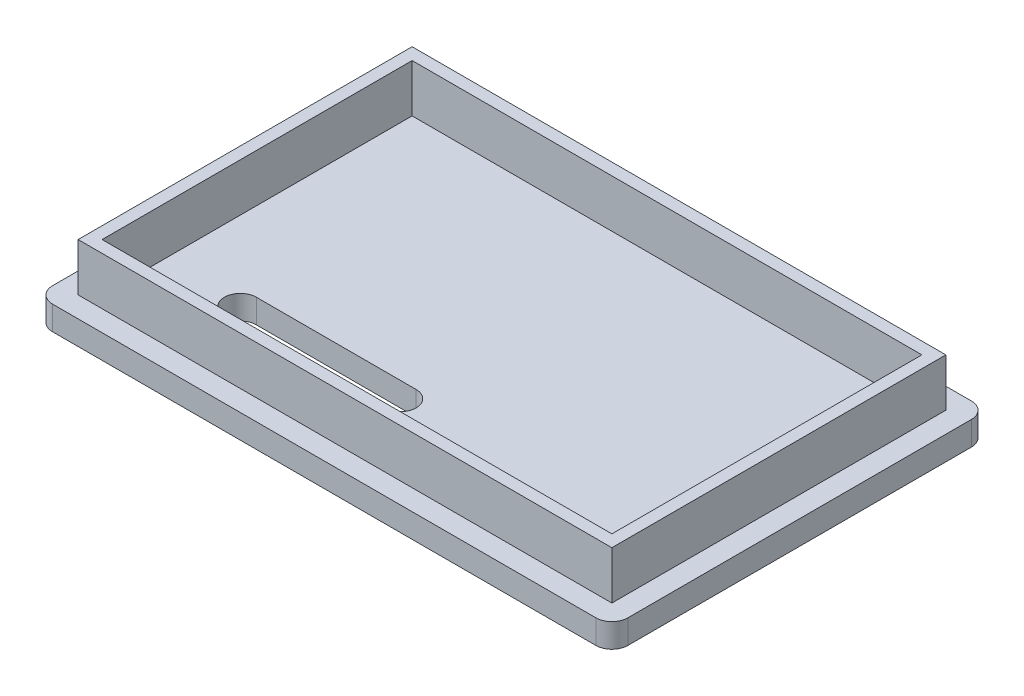
ISO-10303-21;
HEADER;
FILE_DESCRIPTION(('STEP AP214'),'2;1');
FILE_NAME('part.step','',(''),(''),'','','');
FILE_SCHEMA(('AUTOMOTIVE_DESIGN { 1 0 10303 214 1 1 1 1 }'));
ENDSEC;
DATA;
#1=APPLICATION_CONTEXT('core data for automotive mechanical design processes');
#2=APPLICATION_PROTOCOL_DEFINITION('international standard','automotive_design',2000,#1);
#3=PRODUCT_CONTEXT('',#1,'mechanical');
#4=PRODUCT('Part','Part','',(#3));
#5=PRODUCT_RELATED_PRODUCT_CATEGORY('part','',(#4));
#6=PRODUCT_DEFINITION_FORMATION('','',#4);
#7=PRODUCT_DEFINITION_CONTEXT('part definition',#1,'design');
#8=PRODUCT_DEFINITION('design','',#6,#7);
#9=PRODUCT_DEFINITION_SHAPE('','',#8);
#10=(LENGTH_UNIT() NAMED_UNIT(*) SI_UNIT(.MILLI.,.METRE.));
#11=(NAMED_UNIT(*) PLANE_ANGLE_UNIT() SI_UNIT($,.RADIAN.));
#12=(NAMED_UNIT(*) SI_UNIT($,.STERADIAN.) SOLID_ANGLE_UNIT());
#13=UNCERTAINTY_MEASURE_WITH_UNIT(LENGTH_MEASURE(1.E-05),#10,'distance_accuracy_value','');
#14=(GEOMETRIC_REPRESENTATION_CONTEXT(3) GLOBAL_UNCERTAINTY_ASSIGNED_CONTEXT((#13)) GLOBAL_UNIT_ASSIGNED_CONTEXT((#10,
#11,#12)) REPRESENTATION_CONTEXT('',''));
#15=CARTESIAN_POINT('',(0.,0.,0.));
#16=DIRECTION('',(0.,0.,1.));
#17=DIRECTION('',(1.,0.,0.));
#18=AXIS2_PLACEMENT_3D('',#15,#16,#17);
#19=CARTESIAN_POINT('',(0.,3.,0.));
#20=DIRECTION('',(0.,-1.,0.));
#21=DIRECTION('',(0.,0.,-1.));
#22=AXIS2_PLACEMENT_3D('',#19,#20,#21);
#23=PLANE('',#22);
#24=DIRECTION('',(0.,0.,-1.));
#25=VECTOR('',#24,1.);
#26=CARTESIAN_POINT('',(0.,3.,0.));
#27=LINE('',#26,#25);
#28=CARTESIAN_POINT('',(0.,3.,-2.));
#29=VERTEX_POINT('',#28);
#30=CARTESIAN_POINT('',(0.,3.,-45.));
#31=VERTEX_POINT('',#30);
#32=EDGE_CURVE('E306',#29,#31,#27,.T.);
#33=ORIENTED_EDGE('',*,*,#32,.F.);
#34=CARTESIAN_POINT('',(2.,3.,-2.));
#35=DIRECTION('',(0.,-1.,0.));
#36=DIRECTION('',(0.,0.,-1.));
#37=AXIS2_PLACEMENT_3D('',#34,#35,#36);
#38=CIRCLE('',#37,2.);
#39=CARTESIAN_POINT('',(2.,3.,0.));
#40=VERTEX_POINT('',#39);
#41=EDGE_CURVE('E372',#29,#40,#38,.F.);
#42=ORIENTED_EDGE('',*,*,#41,.T.);
#43=DIRECTION('',(1.,0.,0.));
#44=VECTOR('',#43,1.);
#45=CARTESIAN_POINT('',(0.,3.,0.));
#46=LINE('',#45,#44);
#47=CARTESIAN_POINT('',(70.,3.,0.));
#48=VERTEX_POINT('',#47);
#49=EDGE_CURVE('E319',#40,#48,#46,.T.);
#50=ORIENTED_EDGE('',*,*,#49,.T.);
#51=CARTESIAN_POINT('',(70.,3.,-2.));
#52=DIRECTION('',(0.,-1.,0.));
#53=DIRECTION('',(0.,0.,-1.));
#54=AXIS2_PLACEMENT_3D('',#51,#52,#53);
#55=CIRCLE('',#54,2.);
#56=CARTESIAN_POINT('',(72.,3.,-2.));
#57=VERTEX_POINT('',#56);
#58=EDGE_CURVE('E363',#48,#57,#55,.F.);
#59=ORIENTED_EDGE('',*,*,#58,.T.);
#60=DIRECTION('',(0.,0.,-1.));
#61=VECTOR('',#60,1.);
#62=CARTESIAN_POINT('',(72.,3.,0.));
#63=LINE('',#62,#61);
#64=CARTESIAN_POINT('',(72.,3.,-45.));
#65=VERTEX_POINT('',#64);
#66=EDGE_CURVE('E315',#57,#65,#63,.T.);
#67=ORIENTED_EDGE('',*,*,#66,.T.);
#68=CARTESIAN_POINT('',(70.,3.,-45.));
#69=DIRECTION('',(0.,-1.,0.));
#70=DIRECTION('',(0.,0.,-1.));
#71=AXIS2_PLACEMENT_3D('',#68,#69,#70);
#72=CIRCLE('',#71,2.);
#73=CARTESIAN_POINT('',(70.,3.,-47.));
#74=VERTEX_POINT('',#73);
#75=EDGE_CURVE('E366',#65,#74,#72,.F.);
#76=ORIENTED_EDGE('',*,*,#75,.T.);
#77=DIRECTION('',(1.,0.,0.));
#78=VECTOR('',#77,1.);
#79=CARTESIAN_POINT('',(0.,3.,-47.));
#80=LINE('',#79,#78);
#81=CARTESIAN_POINT('',(2.,3.,-47.));
#82=VERTEX_POINT('',#81);
#83=EDGE_CURVE('E310',#82,#74,#80,.T.);
#84=ORIENTED_EDGE('',*,*,#83,.F.);
#85=CARTESIAN_POINT('',(2.,3.,-45.));
#86=DIRECTION('',(0.,-1.,0.));
#87=DIRECTION('',(0.,0.,-1.));
#88=AXIS2_PLACEMENT_3D('',#85,#86,#87);
#89=CIRCLE('',#88,2.);
#90=EDGE_CURVE('E369',#82,#31,#89,.F.);
#91=ORIENTED_EDGE('',*,*,#90,.T.);
#92=EDGE_LOOP('',(#33,#42,#50,#59,#67,#76,#84,#91));
#93=FACE_BOUND('',#92,.T.);
#94=DIRECTION('',(0.,0.,1.));
#95=VECTOR('',#94,1.);
#96=CARTESIAN_POINT('',(2.6,3.,-44.4));
#97=LINE('',#96,#95);
#98=CARTESIAN_POINT('',(2.6,3.,-44.4));
#99=VERTEX_POINT('',#98);
#100=CARTESIAN_POINT('',(2.6,3.,-2.6));
#101=VERTEX_POINT('',#100);
#102=EDGE_CURVE('E260',#99,#101,#97,.T.);
#103=ORIENTED_EDGE('',*,*,#102,.F.);
#104=DIRECTION('',(-1.,0.,0.));
#105=VECTOR('',#104,1.);
#106=CARTESIAN_POINT('',(2.6,3.,-44.4));
#107=LINE('',#106,#105);
#108=CARTESIAN_POINT('',(69.4,3.,-44.4));
#109=VERTEX_POINT('',#108);
#110=EDGE_CURVE('E266',#109,#99,#107,.T.);
#111=ORIENTED_EDGE('',*,*,#110,.F.);
#112=DIRECTION('',(0.,0.,-1.));
#113=VECTOR('',#112,1.);
#114=CARTESIAN_POINT('',(69.4,3.,-44.4));
#115=LINE('',#114,#113);
#116=CARTESIAN_POINT('',(69.4,3.,-2.6));
#117=VERTEX_POINT('',#116);
#118=EDGE_CURVE('E283',#117,#109,#115,.T.);
#119=ORIENTED_EDGE('',*,*,#118,.F.);
#120=DIRECTION('',(1.,0.,0.));
#121=VECTOR('',#120,1.);
#122=CARTESIAN_POINT('',(2.6,3.,-2.6));
#123=LINE('',#122,#121);
#124=EDGE_CURVE('E279',#101,#117,#123,.T.);
#125=ORIENTED_EDGE('',*,*,#124,.F.);
#126=EDGE_LOOP('',(#103,#111,#119,#125));
#127=FACE_BOUND('',#126,.T.);
#128=ADVANCED_FACE('F45',(#93,#127),#23,.F.);
#129=CARTESIAN_POINT('',(0.,3.,0.));
#130=DIRECTION('',(-1.,0.,0.));
#131=DIRECTION('',(0.,0.,1.));
#132=AXIS2_PLACEMENT_3D('',#129,#130,#131);
#133=PLANE('',#132);
#134=DIRECTION('',(0.,0.,-1.));
#135=VECTOR('',#134,1.);
#136=CARTESIAN_POINT('',(0.,0.,0.));
#137=LINE('',#136,#135);
#138=CARTESIAN_POINT('',(0.,0.,-2.));
#139=VERTEX_POINT('',#138);
#140=CARTESIAN_POINT('',(0.,0.,-45.));
#141=VERTEX_POINT('',#140);
#142=EDGE_CURVE('E305',#139,#141,#137,.T.);
#143=ORIENTED_EDGE('',*,*,#142,.F.);
#144=DIRECTION('',(0.,-1.,0.));
#145=VECTOR('',#144,1.);
#146=CARTESIAN_POINT('',(0.,3.,-2.));
#147=LINE('',#146,#145);
#148=EDGE_CURVE('E360',#139,#29,#147,.F.);
#149=ORIENTED_EDGE('',*,*,#148,.T.);
#150=ORIENTED_EDGE('',*,*,#32,.T.);
#151=DIRECTION('',(0.,-1.,0.));
#152=VECTOR('',#151,1.);
#153=CARTESIAN_POINT('',(0.,3.,-45.));
#154=LINE('',#153,#152);
#155=EDGE_CURVE('E356',#31,#141,#154,.T.);
#156=ORIENTED_EDGE('',*,*,#155,.T.);
#157=EDGE_LOOP('',(#143,#149,#150,#156));
#158=FACE_BOUND('',#157,.T.);
#159=ADVANCED_FACE('F414',(#158),#133,.T.);
#160=CARTESIAN_POINT('',(0.,3.,0.));
#161=DIRECTION('',(0.,0.,-1.));
#162=DIRECTION('',(-1.,0.,0.));
#163=AXIS2_PLACEMENT_3D('',#160,#161,#162);
#164=PLANE('',#163);
#165=ORIENTED_EDGE('',*,*,#49,.F.);
#166=DIRECTION('',(0.,-1.,0.));
#167=VECTOR('',#166,1.);
#168=CARTESIAN_POINT('',(2.,0.,0.));
#169=LINE('',#168,#167);
#170=CARTESIAN_POINT('',(2.,0.,0.));
#171=VERTEX_POINT('',#170);
#172=EDGE_CURVE('E340',#40,#171,#169,.T.);
#173=ORIENTED_EDGE('',*,*,#172,.T.);
#174=DIRECTION('',(1.,0.,0.));
#175=VECTOR('',#174,1.);
#176=CARTESIAN_POINT('',(0.,0.,0.));
#177=LINE('',#176,#175);
#178=CARTESIAN_POINT('',(70.,0.,0.));
#179=VERTEX_POINT('',#178);
#180=EDGE_CURVE('E311',#171,#179,#177,.T.);
#181=ORIENTED_EDGE('',*,*,#180,.T.);
#182=DIRECTION('',(0.,-1.,0.));
#183=VECTOR('',#182,1.);
#184=CARTESIAN_POINT('',(70.,3.,0.));
#185=LINE('',#184,#183);
#186=EDGE_CURVE('E323',#179,#48,#185,.F.);
#187=ORIENTED_EDGE('',*,*,#186,.T.);
#188=EDGE_LOOP('',(#165,#173,#181,#187));
#189=FACE_BOUND('',#188,.T.);
#190=ADVANCED_FACE('F421',(#189),#164,.F.);
#191=CARTESIAN_POINT('',(72.,3.,0.));
#192=DIRECTION('',(-1.,0.,0.));
#193=DIRECTION('',(0.,0.,1.));
#194=AXIS2_PLACEMENT_3D('',#191,#192,#193);
#195=PLANE('',#194);
#196=DIRECTION('',(0.,0.,-1.));
#197=VECTOR('',#196,1.);
#198=CARTESIAN_POINT('',(72.,0.,0.));
#199=LINE('',#198,#197);
#200=CARTESIAN_POINT('',(72.,0.,-2.));
#201=VERTEX_POINT('',#200);
#202=CARTESIAN_POINT('',(72.,0.,-45.));
#203=VERTEX_POINT('',#202);
#204=EDGE_CURVE('E331',#201,#203,#199,.T.);
#205=ORIENTED_EDGE('',*,*,#204,.T.);
#206=DIRECTION('',(0.,-1.,0.));
#207=VECTOR('',#206,1.);
#208=CARTESIAN_POINT('',(72.,3.,-45.));
#209=LINE('',#208,#207);
#210=EDGE_CURVE('E386',#203,#65,#209,.F.);
#211=ORIENTED_EDGE('',*,*,#210,.T.);
#212=ORIENTED_EDGE('',*,*,#66,.F.);
#213=DIRECTION('',(0.,-1.,0.));
#214=VECTOR('',#213,1.);
#215=CARTESIAN_POINT('',(72.,3.,-2.));
#216=LINE('',#215,#214);
#217=EDGE_CURVE('E382',#57,#201,#216,.T.);
#218=ORIENTED_EDGE('',*,*,#217,.T.);
#219=EDGE_LOOP('',(#205,#211,#212,#218));
#220=FACE_BOUND('',#219,.T.);
#221=ADVANCED_FACE('F436',(#220),#195,.F.);
#222=CARTESIAN_POINT('',(0.,3.,-47.));
#223=DIRECTION('',(0.,0.,-1.));
#224=DIRECTION('',(-1.,0.,0.));
#225=AXIS2_PLACEMENT_3D('',#222,#223,#224);
#226=PLANE('',#225);
#227=DIRECTION('',(1.,0.,0.));
#228=VECTOR('',#227,1.);
#229=CARTESIAN_POINT('',(0.,0.,-47.));
#230=LINE('',#229,#228);
#231=CARTESIAN_POINT('',(2.,0.,-47.));
#232=VERTEX_POINT('',#231);
#233=CARTESIAN_POINT('',(70.,0.,-47.));
#234=VERTEX_POINT('',#233);
#235=EDGE_CURVE('E327',#232,#234,#230,.T.);
#236=ORIENTED_EDGE('',*,*,#235,.F.);
#237=DIRECTION('',(0.,-1.,0.));
#238=VECTOR('',#237,1.);
#239=CARTESIAN_POINT('',(2.,3.,-47.));
#240=LINE('',#239,#238);
#241=EDGE_CURVE('E379',#232,#82,#240,.F.);
#242=ORIENTED_EDGE('',*,*,#241,.T.);
#243=ORIENTED_EDGE('',*,*,#83,.T.);
#244=DIRECTION('',(0.,-1.,0.));
#245=VECTOR('',#244,1.);
#246=CARTESIAN_POINT('',(70.,0.,-47.));
#247=LINE('',#246,#245);
#248=EDGE_CURVE('E375',#74,#234,#247,.T.);
#249=ORIENTED_EDGE('',*,*,#248,.T.);
#250=EDGE_LOOP('',(#236,#242,#243,#249));
#251=FACE_BOUND('',#250,.T.);
#252=ADVANCED_FACE('F433',(#251),#226,.T.);
#253=CARTESIAN_POINT('',(0.,0.,0.));
#254=DIRECTION('',(0.,-1.,0.));
#255=DIRECTION('',(0.,0.,-1.));
#256=AXIS2_PLACEMENT_3D('',#253,#254,#255);
#257=PLANE('',#256);
#258=CARTESIAN_POINT('',(14.,0.,-11.5));
#259=DIRECTION('',(0.,-1.,0.));
#260=DIRECTION('',(0.,0.,-1.));
#261=AXIS2_PLACEMENT_3D('',#258,#259,#260);
#262=CIRCLE('',#261,2.);
#263=CARTESIAN_POINT('',(14.,0.,-9.5));
#264=VERTEX_POINT('',#263);
#265=CARTESIAN_POINT('',(14.,0.,-13.5));
#266=VERTEX_POINT('',#265);
#267=EDGE_CURVE('E61',#264,#266,#262,.T.);
#268=ORIENTED_EDGE('',*,*,#267,.F.);
#269=DIRECTION('',(-1.,0.,0.));
#270=VECTOR('',#269,1.);
#271=CARTESIAN_POINT('',(14.,0.,-9.5));
#272=LINE('',#271,#270);
#273=CARTESIAN_POINT('',(34.,0.,-9.49999999999999));
#274=VERTEX_POINT('',#273);
#275=EDGE_CURVE('E204',#274,#264,#272,.T.);
#276=ORIENTED_EDGE('',*,*,#275,.F.);
#277=CARTESIAN_POINT('',(34.,0.,-11.5));
#278=DIRECTION('',(0.,-1.,0.));
#279=DIRECTION('',(0.,0.,-1.));
#280=AXIS2_PLACEMENT_3D('',#277,#278,#279);
#281=CIRCLE('',#280,2.);
#282=CARTESIAN_POINT('',(34.,0.,-13.5));
#283=VERTEX_POINT('',#282);
#284=EDGE_CURVE('E186',#283,#274,#281,.T.);
#285=ORIENTED_EDGE('',*,*,#284,.F.);
#286=DIRECTION('',(1.,0.,0.));
#287=VECTOR('',#286,1.);
#288=CARTESIAN_POINT('',(14.,0.,-13.5));
#289=LINE('',#288,#287);
#290=EDGE_CURVE('E196',#266,#283,#289,.T.);
#291=ORIENTED_EDGE('',*,*,#290,.F.);
#292=EDGE_LOOP('',(#268,#276,#285,#291));
#293=FACE_BOUND('',#292,.T.);
#294=ORIENTED_EDGE('',*,*,#180,.F.);
#295=CARTESIAN_POINT('',(2.,0.,-2.));
#296=DIRECTION('',(0.,-1.,0.));
#297=DIRECTION('',(0.,0.,-1.));
#298=AXIS2_PLACEMENT_3D('',#295,#296,#297);
#299=CIRCLE('',#298,2.);
#300=EDGE_CURVE('E353',#171,#139,#299,.T.);
#301=ORIENTED_EDGE('',*,*,#300,.T.);
#302=ORIENTED_EDGE('',*,*,#142,.T.);
#303=CARTESIAN_POINT('',(2.,0.,-45.));
#304=DIRECTION('',(0.,-1.,0.));
#305=DIRECTION('',(0.,0.,-1.));
#306=AXIS2_PLACEMENT_3D('',#303,#304,#305);
#307=CIRCLE('',#306,2.);
#308=EDGE_CURVE('E350',#141,#232,#307,.T.);
#309=ORIENTED_EDGE('',*,*,#308,.T.);
#310=ORIENTED_EDGE('',*,*,#235,.T.);
#311=CARTESIAN_POINT('',(70.,0.,-45.));
#312=DIRECTION('',(0.,-1.,0.));
#313=DIRECTION('',(0.,0.,-1.));
#314=AXIS2_PLACEMENT_3D('',#311,#312,#313);
#315=CIRCLE('',#314,2.);
#316=EDGE_CURVE('E347',#234,#203,#315,.T.);
#317=ORIENTED_EDGE('',*,*,#316,.T.);
#318=ORIENTED_EDGE('',*,*,#204,.F.);
#319=CARTESIAN_POINT('',(70.,0.,-2.));
#320=DIRECTION('',(0.,-1.,0.));
#321=DIRECTION('',(0.,0.,-1.));
#322=AXIS2_PLACEMENT_3D('',#319,#320,#321);
#323=CIRCLE('',#322,2.);
#324=EDGE_CURVE('E344',#201,#179,#323,.T.);
#325=ORIENTED_EDGE('',*,*,#324,.T.);
#326=EDGE_LOOP('',(#294,#301,#302,#309,#310,#317,#318,#325));
#327=FACE_BOUND('',#326,.T.);
#328=ADVANCED_FACE('F201',(#293,#327),#257,.T.);
#329=CARTESIAN_POINT('',(2.,3.,-2.));
#330=DIRECTION('',(0.,1.,0.));
#331=DIRECTION('',(0.,0.,1.));
#332=AXIS2_PLACEMENT_3D('',#329,#330,#331);
#333=CYLINDRICAL_SURFACE('',#332,2.);
#334=ORIENTED_EDGE('',*,*,#41,.F.);
#335=ORIENTED_EDGE('',*,*,#148,.F.);
#336=ORIENTED_EDGE('',*,*,#300,.F.);
#337=ORIENTED_EDGE('',*,*,#172,.F.);
#338=EDGE_LOOP('',(#334,#335,#336,#337));
#339=FACE_BOUND('',#338,.T.);
#340=ADVANCED_FACE('F432',(#339),#333,.T.);
#341=CARTESIAN_POINT('',(2.,3.,-45.));
#342=DIRECTION('',(0.,-1.,0.));
#343=DIRECTION('',(0.,0.,-1.));
#344=AXIS2_PLACEMENT_3D('',#341,#342,#343);
#345=CYLINDRICAL_SURFACE('',#344,2.);
#346=ORIENTED_EDGE('',*,*,#90,.F.);
#347=ORIENTED_EDGE('',*,*,#241,.F.);
#348=ORIENTED_EDGE('',*,*,#308,.F.);
#349=ORIENTED_EDGE('',*,*,#155,.F.);
#350=EDGE_LOOP('',(#346,#347,#348,#349));
#351=FACE_BOUND('',#350,.T.);
#352=ADVANCED_FACE('F446',(#351),#345,.T.);
#353=CARTESIAN_POINT('',(70.,3.,-45.));
#354=DIRECTION('',(0.,1.,0.));
#355=DIRECTION('',(0.,0.,1.));
#356=AXIS2_PLACEMENT_3D('',#353,#354,#355);
#357=CYLINDRICAL_SURFACE('',#356,2.);
#358=ORIENTED_EDGE('',*,*,#75,.F.);
#359=ORIENTED_EDGE('',*,*,#210,.F.);
#360=ORIENTED_EDGE('',*,*,#316,.F.);
#361=ORIENTED_EDGE('',*,*,#248,.F.);
#362=EDGE_LOOP('',(#358,#359,#360,#361));
#363=FACE_BOUND('',#362,.T.);
#364=ADVANCED_FACE('F449',(#363),#357,.T.);
#365=CARTESIAN_POINT('',(70.,3.,-2.));
#366=DIRECTION('',(0.,-1.,0.));
#367=DIRECTION('',(0.,0.,-1.));
#368=AXIS2_PLACEMENT_3D('',#365,#366,#367);
#369=CYLINDRICAL_SURFACE('',#368,2.);
#370=ORIENTED_EDGE('',*,*,#58,.F.);
#371=ORIENTED_EDGE('',*,*,#186,.F.);
#372=ORIENTED_EDGE('',*,*,#324,.F.);
#373=ORIENTED_EDGE('',*,*,#217,.F.);
#374=EDGE_LOOP('',(#370,#371,#372,#373));
#375=FACE_BOUND('',#374,.T.);
#376=ADVANCED_FACE('F47',(#375),#369,.T.);
#377=CARTESIAN_POINT('',(0.,9.,0.));
#378=DIRECTION('',(0.,1.,0.));
#379=DIRECTION('',(0.,0.,1.));
#380=AXIS2_PLACEMENT_3D('',#377,#378,#379);
#381=PLANE('',#380);
#382=DIRECTION('',(0.,0.,1.));
#383=VECTOR('',#382,1.);
#384=CARTESIAN_POINT('',(2.6,9.,-44.4));
#385=LINE('',#384,#383);
#386=CARTESIAN_POINT('',(2.6,9.,-44.4));
#387=VERTEX_POINT('',#386);
#388=CARTESIAN_POINT('',(2.6,9.,-2.6));
#389=VERTEX_POINT('',#388);
#390=EDGE_CURVE('E261',#387,#389,#385,.T.);
#391=ORIENTED_EDGE('',*,*,#390,.T.);
#392=DIRECTION('',(1.,0.,0.));
#393=VECTOR('',#392,1.);
#394=CARTESIAN_POINT('',(2.6,9.,-2.6));
#395=LINE('',#394,#393);
#396=CARTESIAN_POINT('',(69.4,9.,-2.6));
#397=VERTEX_POINT('',#396);
#398=EDGE_CURVE('E265',#389,#397,#395,.T.);
#399=ORIENTED_EDGE('',*,*,#398,.T.);
#400=DIRECTION('',(0.,0.,-1.));
#401=VECTOR('',#400,1.);
#402=CARTESIAN_POINT('',(69.4,9.,-44.4));
#403=LINE('',#402,#401);
#404=CARTESIAN_POINT('',(69.4,9.,-44.4));
#405=VERTEX_POINT('',#404);
#406=EDGE_CURVE('E269',#397,#405,#403,.T.);
#407=ORIENTED_EDGE('',*,*,#406,.T.);
#408=DIRECTION('',(-1.,0.,0.));
#409=VECTOR('',#408,1.);
#410=CARTESIAN_POINT('',(2.6,9.,-44.4));
#411=LINE('',#410,#409);
#412=EDGE_CURVE('E272',#405,#387,#411,.T.);
#413=ORIENTED_EDGE('',*,*,#412,.T.);
#414=EDGE_LOOP('',(#391,#399,#407,#413));
#415=FACE_BOUND('',#414,.T.);
#416=DIRECTION('',(1.,0.,0.));
#417=VECTOR('',#416,1.);
#418=CARTESIAN_POINT('',(4.1,9.,-4.1));
#419=LINE('',#418,#417);
#420=CARTESIAN_POINT('',(4.1,9.,-4.1));
#421=VERTEX_POINT('',#420);
#422=CARTESIAN_POINT('',(67.9,9.,-4.1));
#423=VERTEX_POINT('',#422);
#424=EDGE_CURVE('E222',#421,#423,#419,.T.);
#425=ORIENTED_EDGE('',*,*,#424,.F.);
#426=DIRECTION('',(0.,0.,1.));
#427=VECTOR('',#426,1.);
#428=CARTESIAN_POINT('',(4.1,9.,-42.9));
#429=LINE('',#428,#427);
#430=CARTESIAN_POINT('',(4.1,9.,-42.9));
#431=VERTEX_POINT('',#430);
#432=EDGE_CURVE('E219',#431,#421,#429,.T.);
#433=ORIENTED_EDGE('',*,*,#432,.F.);
#434=DIRECTION('',(-1.,0.,0.));
#435=VECTOR('',#434,1.);
#436=CARTESIAN_POINT('',(4.1,9.,-42.9));
#437=LINE('',#436,#435);
#438=CARTESIAN_POINT('',(67.9,9.,-42.9));
#439=VERTEX_POINT('',#438);
#440=EDGE_CURVE('E230',#439,#431,#437,.T.);
#441=ORIENTED_EDGE('',*,*,#440,.F.);
#442=DIRECTION('',(0.,0.,-1.));
#443=VECTOR('',#442,1.);
#444=CARTESIAN_POINT('',(67.9,9.,-42.9));
#445=LINE('',#444,#443);
#446=EDGE_CURVE('E226',#423,#439,#445,.T.);
#447=ORIENTED_EDGE('',*,*,#446,.F.);
#448=EDGE_LOOP('',(#425,#433,#441,#447));
#449=FACE_BOUND('',#448,.T.);
#450=ADVANCED_FACE('F455',(#415,#449),#381,.T.);
#451=CARTESIAN_POINT('',(2.6,9.,-44.4));
#452=DIRECTION('',(1.,0.,0.));
#453=DIRECTION('',(0.,0.,-1.));
#454=AXIS2_PLACEMENT_3D('',#451,#452,#453);
#455=PLANE('',#454);
#456=ORIENTED_EDGE('',*,*,#102,.T.);
#457=DIRECTION('',(0.,-1.,0.));
#458=VECTOR('',#457,1.);
#459=CARTESIAN_POINT('',(2.6,9.,-2.6));
#460=LINE('',#459,#458);
#461=EDGE_CURVE('E301',#389,#101,#460,.T.);
#462=ORIENTED_EDGE('',*,*,#461,.F.);
#463=ORIENTED_EDGE('',*,*,#390,.F.);
#464=DIRECTION('',(0.,-1.,0.));
#465=VECTOR('',#464,1.);
#466=CARTESIAN_POINT('',(2.6,9.,-44.4));
#467=LINE('',#466,#465);
#468=EDGE_CURVE('E275',#387,#99,#467,.T.);
#469=ORIENTED_EDGE('',*,*,#468,.T.);
#470=EDGE_LOOP('',(#456,#462,#463,#469));
#471=FACE_BOUND('',#470,.T.);
#472=ADVANCED_FACE('F428',(#471),#455,.F.);
#473=CARTESIAN_POINT('',(2.6,9.,-2.6));
#474=DIRECTION('',(0.,0.,-1.));
#475=DIRECTION('',(-1.,0.,0.));
#476=AXIS2_PLACEMENT_3D('',#473,#474,#475);
#477=PLANE('',#476);
#478=ORIENTED_EDGE('',*,*,#124,.T.);
#479=DIRECTION('',(0.,-1.,0.));
#480=VECTOR('',#479,1.);
#481=CARTESIAN_POINT('',(69.4,9.,-2.6));
#482=LINE('',#481,#480);
#483=EDGE_CURVE('E297',#397,#117,#482,.T.);
#484=ORIENTED_EDGE('',*,*,#483,.F.);
#485=ORIENTED_EDGE('',*,*,#398,.F.);
#486=ORIENTED_EDGE('',*,*,#461,.T.);
#487=EDGE_LOOP('',(#478,#484,#485,#486));
#488=FACE_BOUND('',#487,.T.);
#489=ADVANCED_FACE('F483',(#488),#477,.F.);
#490=CARTESIAN_POINT('',(69.4,9.,-44.4));
#491=DIRECTION('',(-1.,0.,0.));
#492=DIRECTION('',(0.,0.,1.));
#493=AXIS2_PLACEMENT_3D('',#490,#491,#492);
#494=PLANE('',#493);
#495=ORIENTED_EDGE('',*,*,#118,.T.);
#496=DIRECTION('',(0.,-1.,0.));
#497=VECTOR('',#496,1.);
#498=CARTESIAN_POINT('',(69.4,9.,-44.4));
#499=LINE('',#498,#497);
#500=EDGE_CURVE('E293',#405,#109,#499,.T.);
#501=ORIENTED_EDGE('',*,*,#500,.F.);
#502=ORIENTED_EDGE('',*,*,#406,.F.);
#503=ORIENTED_EDGE('',*,*,#483,.T.);
#504=EDGE_LOOP('',(#495,#501,#502,#503));
#505=FACE_BOUND('',#504,.T.);
#506=ADVANCED_FACE('F493',(#505),#494,.F.);
#507=CARTESIAN_POINT('',(2.6,9.,-44.4));
#508=DIRECTION('',(0.,0.,1.));
#509=DIRECTION('',(1.,0.,0.));
#510=AXIS2_PLACEMENT_3D('',#507,#508,#509);
#511=PLANE('',#510);
#512=ORIENTED_EDGE('',*,*,#110,.T.);
#513=ORIENTED_EDGE('',*,*,#468,.F.);
#514=ORIENTED_EDGE('',*,*,#412,.F.);
#515=ORIENTED_EDGE('',*,*,#500,.T.);
#516=EDGE_LOOP('',(#512,#513,#514,#515));
#517=FACE_BOUND('',#516,.T.);
#518=ADVANCED_FACE('F490',(#517),#511,.F.);
#519=CARTESIAN_POINT('',(4.1,9.,-42.9));
#520=DIRECTION('',(1.,0.,0.));
#521=DIRECTION('',(0.,0.,-1.));
#522=AXIS2_PLACEMENT_3D('',#519,#520,#521);
#523=PLANE('',#522);
#524=DIRECTION('',(0.,0.,1.));
#525=VECTOR('',#524,1.);
#526=CARTESIAN_POINT('',(4.1,3.,-42.9));
#527=LINE('',#526,#525);
#528=CARTESIAN_POINT('',(4.1,3.,-42.9));
#529=VERTEX_POINT('',#528);
#530=CARTESIAN_POINT('',(4.1,3.,-4.1));
#531=VERTEX_POINT('',#530);
#532=EDGE_CURVE('E214',#529,#531,#527,.T.);
#533=ORIENTED_EDGE('',*,*,#532,.F.);
#534=DIRECTION('',(0.,-1.,0.));
#535=VECTOR('',#534,1.);
#536=CARTESIAN_POINT('',(4.1,9.,-42.9));
#537=LINE('',#536,#535);
#538=EDGE_CURVE('E233',#431,#529,#537,.T.);
#539=ORIENTED_EDGE('',*,*,#538,.F.);
#540=ORIENTED_EDGE('',*,*,#432,.T.);
#541=DIRECTION('',(0.,-1.,0.));
#542=VECTOR('',#541,1.);
#543=CARTESIAN_POINT('',(4.1,9.,-4.1));
#544=LINE('',#543,#542);
#545=EDGE_CURVE('E256',#421,#531,#544,.T.);
#546=ORIENTED_EDGE('',*,*,#545,.T.);
#547=EDGE_LOOP('',(#533,#539,#540,#546));
#548=FACE_BOUND('',#547,.T.);
#549=ADVANCED_FACE('F488',(#548),#523,.T.);
#550=CARTESIAN_POINT('',(4.1,9.,-4.1));
#551=DIRECTION('',(0.,0.,-1.));
#552=DIRECTION('',(-1.,0.,0.));
#553=AXIS2_PLACEMENT_3D('',#550,#551,#552);
#554=PLANE('',#553);
#555=DIRECTION('',(1.,0.,0.));
#556=VECTOR('',#555,1.);
#557=CARTESIAN_POINT('',(4.1,3.,-4.1));
#558=LINE('',#557,#556);
#559=CARTESIAN_POINT('',(67.9,3.,-4.1));
#560=VERTEX_POINT('',#559);
#561=EDGE_CURVE('E237',#531,#560,#558,.T.);
#562=ORIENTED_EDGE('',*,*,#561,.F.);
#563=ORIENTED_EDGE('',*,*,#545,.F.);
#564=ORIENTED_EDGE('',*,*,#424,.T.);
#565=DIRECTION('',(0.,-1.,0.));
#566=VECTOR('',#565,1.);
#567=CARTESIAN_POINT('',(67.9,9.,-4.1));
#568=LINE('',#567,#566);
#569=EDGE_CURVE('E253',#423,#560,#568,.T.);
#570=ORIENTED_EDGE('',*,*,#569,.T.);
#571=EDGE_LOOP('',(#562,#563,#564,#570));
#572=FACE_BOUND('',#571,.T.);
#573=ADVANCED_FACE('F527',(#572),#554,.T.);
#574=CARTESIAN_POINT('',(67.9,9.,-42.9));
#575=DIRECTION('',(-1.,0.,0.));
#576=DIRECTION('',(0.,0.,1.));
#577=AXIS2_PLACEMENT_3D('',#574,#575,#576);
#578=PLANE('',#577);
#579=DIRECTION('',(0.,0.,-1.));
#580=VECTOR('',#579,1.);
#581=CARTESIAN_POINT('',(67.9,3.,-42.9));
#582=LINE('',#581,#580);
#583=CARTESIAN_POINT('',(67.9,3.,-42.9));
#584=VERTEX_POINT('',#583);
#585=EDGE_CURVE('E241',#560,#584,#582,.T.);
#586=ORIENTED_EDGE('',*,*,#585,.F.);
#587=ORIENTED_EDGE('',*,*,#569,.F.);
#588=ORIENTED_EDGE('',*,*,#446,.T.);
#589=DIRECTION('',(0.,-1.,0.));
#590=VECTOR('',#589,1.);
#591=CARTESIAN_POINT('',(67.9,9.,-42.9));
#592=LINE('',#591,#590);
#593=EDGE_CURVE('E250',#439,#584,#592,.T.);
#594=ORIENTED_EDGE('',*,*,#593,.T.);
#595=EDGE_LOOP('',(#586,#587,#588,#594));
#596=FACE_BOUND('',#595,.T.);
#597=ADVANCED_FACE('F535',(#596),#578,.T.);
#598=CARTESIAN_POINT('',(4.1,9.,-42.9));
#599=DIRECTION('',(0.,0.,1.));
#600=DIRECTION('',(1.,0.,0.));
#601=AXIS2_PLACEMENT_3D('',#598,#599,#600);
#602=PLANE('',#601);
#603=DIRECTION('',(-1.,0.,0.));
#604=VECTOR('',#603,1.);
#605=CARTESIAN_POINT('',(4.1,3.,-42.9));
#606=LINE('',#605,#604);
#607=EDGE_CURVE('E223',#584,#529,#606,.T.);
#608=ORIENTED_EDGE('',*,*,#607,.F.);
#609=ORIENTED_EDGE('',*,*,#593,.F.);
#610=ORIENTED_EDGE('',*,*,#440,.T.);
#611=ORIENTED_EDGE('',*,*,#538,.T.);
#612=EDGE_LOOP('',(#608,#609,#610,#611));
#613=FACE_BOUND('',#612,.T.);
#614=ADVANCED_FACE('F409',(#613),#602,.T.);
#615=DIRECTION('',(-1.,0.,0.));
#616=VECTOR('',#615,1.);
#617=CARTESIAN_POINT('',(0.,3.,-9.5));
#618=LINE('',#617,#616);
#619=CARTESIAN_POINT('',(34.,3.,-9.49999999999999));
#620=VERTEX_POINT('',#619);
#621=CARTESIAN_POINT('',(14.,3.,-9.5));
#622=VERTEX_POINT('',#621);
#623=EDGE_CURVE('E54',#620,#622,#618,.T.);
#624=ORIENTED_EDGE('',*,*,#623,.T.);
#625=CARTESIAN_POINT('',(14.,3.,-11.5));
#626=DIRECTION('',(0.,-1.,0.));
#627=DIRECTION('',(0.,0.,-1.));
#628=AXIS2_PLACEMENT_3D('',#625,#626,#627);
#629=CIRCLE('',#628,2.);
#630=CARTESIAN_POINT('',(14.,3.,-13.5));
#631=VERTEX_POINT('',#630);
#632=EDGE_CURVE('E11',#622,#631,#629,.T.);
#633=ORIENTED_EDGE('',*,*,#632,.T.);
#634=DIRECTION('',(1.,0.,0.));
#635=VECTOR('',#634,1.);
#636=CARTESIAN_POINT('',(0.,3.,-13.5));
#637=LINE('',#636,#635);
#638=CARTESIAN_POINT('',(34.,3.,-13.5));
#639=VERTEX_POINT('',#638);
#640=EDGE_CURVE('E389',#631,#639,#637,.T.);
#641=ORIENTED_EDGE('',*,*,#640,.T.);
#642=CARTESIAN_POINT('',(34.,3.,-11.5));
#643=DIRECTION('',(0.,-1.,0.));
#644=DIRECTION('',(0.,0.,-1.));
#645=AXIS2_PLACEMENT_3D('',#642,#643,#644);
#646=CIRCLE('',#645,2.);
#647=EDGE_CURVE('E189',#639,#620,#646,.T.);
#648=ORIENTED_EDGE('',*,*,#647,.T.);
#649=EDGE_LOOP('',(#624,#633,#641,#648));
#650=FACE_BOUND('',#649,.T.);
#651=ORIENTED_EDGE('',*,*,#607,.T.);
#652=ORIENTED_EDGE('',*,*,#532,.T.);
#653=ORIENTED_EDGE('',*,*,#561,.T.);
#654=ORIENTED_EDGE('',*,*,#585,.T.);
#655=EDGE_LOOP('',(#651,#652,#653,#654));
#656=FACE_BOUND('',#655,.T.);
#657=ADVANCED_FACE('F396',(#650,#656),#23,.F.);
#658=CARTESIAN_POINT('',(14.,6.,-11.5));
#659=DIRECTION('',(0.,-1.,0.));
#660=DIRECTION('',(0.,0.,-1.));
#661=AXIS2_PLACEMENT_3D('',#658,#659,#660);
#662=CYLINDRICAL_SURFACE('',#661,2.);
#663=DIRECTION('',(0.,-1.,0.));
#664=VECTOR('',#663,1.);
#665=CARTESIAN_POINT('',(14.,6.,-9.5));
#666=LINE('',#665,#664);
#667=EDGE_CURVE('E211',#622,#264,#666,.T.);
#668=ORIENTED_EDGE('',*,*,#667,.T.);
#669=ORIENTED_EDGE('',*,*,#267,.T.);
#670=DIRECTION('',(0.,-1.,0.));
#671=VECTOR('',#670,1.);
#672=CARTESIAN_POINT('',(14.,6.,-13.5));
#673=LINE('',#672,#671);
#674=EDGE_CURVE('E193',#631,#266,#673,.T.);
#675=ORIENTED_EDGE('',*,*,#674,.F.);
#676=ORIENTED_EDGE('',*,*,#632,.F.);
#677=EDGE_LOOP('',(#668,#669,#675,#676));
#678=FACE_BOUND('',#677,.T.);
#679=ADVANCED_FACE('F401',(#678),#662,.F.);
#680=CARTESIAN_POINT('',(14.,6.,-9.5));
#681=DIRECTION('',(0.,0.,1.));
#682=DIRECTION('',(1.,0.,0.));
#683=AXIS2_PLACEMENT_3D('',#680,#681,#682);
#684=PLANE('',#683);
#685=DIRECTION('',(0.,-1.,0.));
#686=VECTOR('',#685,1.);
#687=CARTESIAN_POINT('',(34.,6.,-9.49999999999999));
#688=LINE('',#687,#686);
#689=EDGE_CURVE('E192',#620,#274,#688,.T.);
#690=ORIENTED_EDGE('',*,*,#689,.T.);
#691=ORIENTED_EDGE('',*,*,#275,.T.);
#692=ORIENTED_EDGE('',*,*,#667,.F.);
#693=ORIENTED_EDGE('',*,*,#623,.F.);
#694=EDGE_LOOP('',(#690,#691,#692,#693));
#695=FACE_BOUND('',#694,.T.);
#696=ADVANCED_FACE('F400',(#695),#684,.F.);
#697=CARTESIAN_POINT('',(34.,6.,-11.5));
#698=DIRECTION('',(0.,-1.,0.));
#699=DIRECTION('',(0.,0.,-1.));
#700=AXIS2_PLACEMENT_3D('',#697,#698,#699);
#701=CYLINDRICAL_SURFACE('',#700,2.);
#702=DIRECTION('',(0.,-1.,0.));
#703=VECTOR('',#702,1.);
#704=CARTESIAN_POINT('',(34.,6.,-13.5));
#705=LINE('',#704,#703);
#706=EDGE_CURVE('E69',#639,#283,#705,.T.);
#707=ORIENTED_EDGE('',*,*,#706,.T.);
#708=ORIENTED_EDGE('',*,*,#284,.T.);
#709=ORIENTED_EDGE('',*,*,#689,.F.);
#710=ORIENTED_EDGE('',*,*,#647,.F.);
#711=EDGE_LOOP('',(#707,#708,#709,#710));
#712=FACE_BOUND('',#711,.T.);
#713=ADVANCED_FACE('F183',(#712),#701,.F.);
#714=CARTESIAN_POINT('',(14.,6.,-13.5));
#715=DIRECTION('',(0.,0.,-1.));
#716=DIRECTION('',(-1.,0.,0.));
#717=AXIS2_PLACEMENT_3D('',#714,#715,#716);
#718=PLANE('',#717);
#719=ORIENTED_EDGE('',*,*,#674,.T.);
#720=ORIENTED_EDGE('',*,*,#290,.T.);
#721=ORIENTED_EDGE('',*,*,#706,.F.);
#722=ORIENTED_EDGE('',*,*,#640,.F.);
#723=EDGE_LOOP('',(#719,#720,#721,#722));
#724=FACE_BOUND('',#723,.T.);
#725=ADVANCED_FACE('F197',(#724),#718,.F.);
#726=CLOSED_SHELL('',(#128,#159,#190,#221,#252,#328,#340,#352,#364,#376,#450,#472,#489,#506,
#518,#549,#573,#597,#614,#657,#679,#696,#713,#725));
#727=MANIFOLD_SOLID_BREP('B2',#726);
#728=ADVANCED_BREP_SHAPE_REPRESENTATION('',(#18,#727),#14);
#729=SHAPE_DEFINITION_REPRESENTATION(#9,#728);
ENDSEC;
END-ISO-10303-21;
